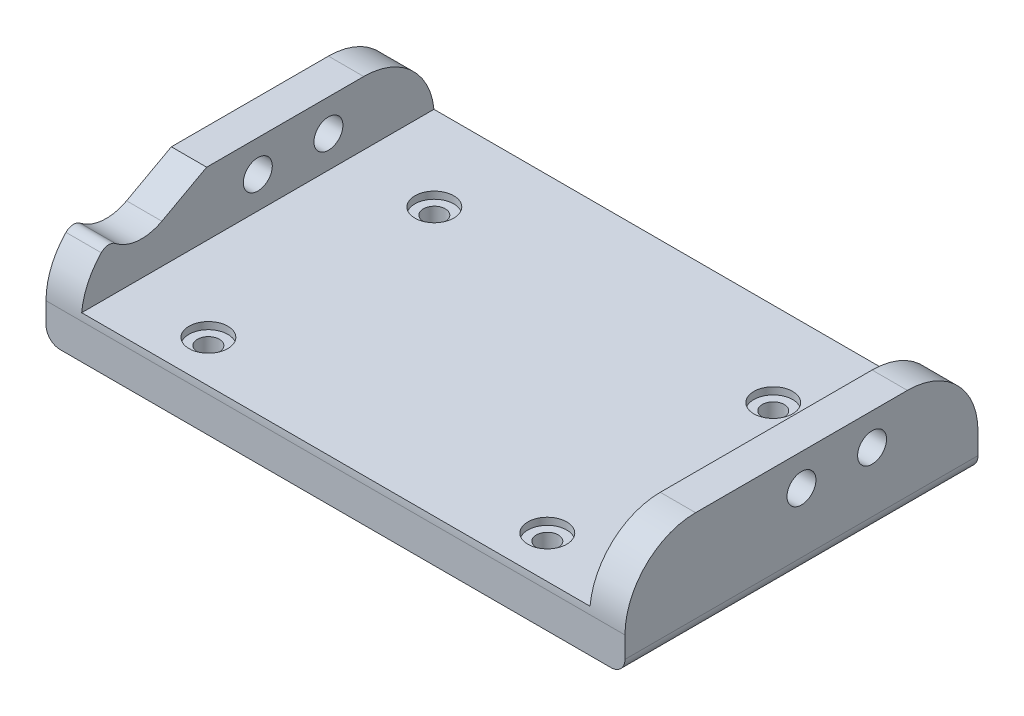
ISO-10303-21;
HEADER;
FILE_DESCRIPTION(('STEP AP214'),'2;1');
FILE_NAME('part.step','',(''),(''),'','','');
FILE_SCHEMA(('AUTOMOTIVE_DESIGN { 1 0 10303 214 1 1 1 1 }'));
ENDSEC;
DATA;
#1=APPLICATION_CONTEXT('core data for automotive mechanical design processes');
#2=APPLICATION_PROTOCOL_DEFINITION('international standard','automotive_design',2000,#1);
#3=PRODUCT_CONTEXT('',#1,'mechanical');
#4=PRODUCT('Part','Part','',(#3));
#5=PRODUCT_RELATED_PRODUCT_CATEGORY('part','',(#4));
#6=PRODUCT_DEFINITION_FORMATION('','',#4);
#7=PRODUCT_DEFINITION_CONTEXT('part definition',#1,'design');
#8=PRODUCT_DEFINITION('design','',#6,#7);
#9=PRODUCT_DEFINITION_SHAPE('','',#8);
#10=(LENGTH_UNIT() NAMED_UNIT(*) SI_UNIT(.MILLI.,.METRE.));
#11=(NAMED_UNIT(*) PLANE_ANGLE_UNIT() SI_UNIT($,.RADIAN.));
#12=(NAMED_UNIT(*) SI_UNIT($,.STERADIAN.) SOLID_ANGLE_UNIT());
#13=UNCERTAINTY_MEASURE_WITH_UNIT(LENGTH_MEASURE(1.E-05),#10,'distance_accuracy_value','');
#14=(GEOMETRIC_REPRESENTATION_CONTEXT(3) GLOBAL_UNCERTAINTY_ASSIGNED_CONTEXT((#13)) GLOBAL_UNIT_ASSIGNED_CONTEXT((#10,
#11,#12)) REPRESENTATION_CONTEXT('',''));
#15=CARTESIAN_POINT('',(0.,0.,0.));
#16=DIRECTION('',(0.,0.,1.));
#17=DIRECTION('',(1.,0.,0.));
#18=AXIS2_PLACEMENT_3D('',#15,#16,#17);
#19=CARTESIAN_POINT('',(-36.,6.,-20.));
#20=DIRECTION('',(0.,0.,1.));
#21=DIRECTION('',(1.,0.,0.));
#22=AXIS2_PLACEMENT_3D('',#19,#20,#21);
#23=PLANE('',#22);
#24=DIRECTION('',(0.,-1.,0.));
#25=VECTOR('',#24,1.);
#26=CARTESIAN_POINT('',(-34.,6.,-20.));
#27=LINE('',#26,#25);
#28=CARTESIAN_POINT('',(-34.,5.,-20.));
#29=VERTEX_POINT('',#28);
#30=CARTESIAN_POINT('',(-34.,0.,-20.));
#31=VERTEX_POINT('',#30);
#32=EDGE_CURVE('E290',#29,#31,#27,.T.);
#33=ORIENTED_EDGE('',*,*,#32,.F.);
#34=DIRECTION('',(-1.,0.,0.));
#35=VECTOR('',#34,1.);
#36=CARTESIAN_POINT('',(-36.,5.,-20.));
#37=LINE('',#36,#35);
#38=CARTESIAN_POINT('',(41.,5.,-20.));
#39=VERTEX_POINT('',#38);
#40=EDGE_CURVE('E216',#29,#39,#37,.F.);
#41=ORIENTED_EDGE('',*,*,#40,.T.);
#42=DIRECTION('',(0.,1.,0.));
#43=VECTOR('',#42,1.);
#44=CARTESIAN_POINT('',(41.,0.,-20.));
#45=LINE('',#44,#43);
#46=CARTESIAN_POINT('',(41.,2.,-20.));
#47=VERTEX_POINT('',#46);
#48=EDGE_CURVE('E202',#47,#39,#45,.T.);
#49=ORIENTED_EDGE('',*,*,#48,.F.);
#50=CARTESIAN_POINT('',(39.,2.,-20.));
#51=DIRECTION('',(0.,0.,1.));
#52=DIRECTION('',(1.,0.,0.));
#53=AXIS2_PLACEMENT_3D('',#50,#51,#52);
#54=CIRCLE('',#53,2.);
#55=CARTESIAN_POINT('',(39.,0.,-20.));
#56=VERTEX_POINT('',#55);
#57=EDGE_CURVE('E240',#47,#56,#54,.F.);
#58=ORIENTED_EDGE('',*,*,#57,.T.);
#59=DIRECTION('',(-1.,0.,0.));
#60=VECTOR('',#59,1.);
#61=CARTESIAN_POINT('',(-36.,0.,-20.));
#62=LINE('',#61,#60);
#63=EDGE_CURVE('E208',#56,#31,#62,.T.);
#64=ORIENTED_EDGE('',*,*,#63,.T.);
#65=EDGE_LOOP('',(#33,#41,#49,#58,#64));
#66=FACE_BOUND('',#65,.T.);
#67=ADVANCED_FACE('F39',(#66),#23,.F.);
#68=CARTESIAN_POINT('',(0.,0.,0.));
#69=DIRECTION('',(0.,1.,0.));
#70=DIRECTION('',(0.,0.,1.));
#71=AXIS2_PLACEMENT_3D('',#68,#69,#70);
#72=PLANE('',#71);
#73=CARTESIAN_POINT('',(24.,0.,24.));
#74=DIRECTION('',(0.,-1.,0.));
#75=DIRECTION('',(0.,0.,-1.));
#76=AXIS2_PLACEMENT_3D('',#73,#74,#75);
#77=CIRCLE('',#76,1.55);
#78=CARTESIAN_POINT('',(24.,0.,22.45));
#79=VERTEX_POINT('',#78);
#80=EDGE_CURVE('E327',#79,#79,#77,.T.);
#81=ORIENTED_EDGE('',*,*,#80,.F.);
#82=EDGE_LOOP('',(#81));
#83=FACE_BOUND('',#82,.T.);
#84=CARTESIAN_POINT('',(-24.,0.,-8.));
#85=DIRECTION('',(0.,-1.,0.));
#86=DIRECTION('',(0.,0.,-1.));
#87=AXIS2_PLACEMENT_3D('',#84,#85,#86);
#88=CIRCLE('',#87,1.55);
#89=CARTESIAN_POINT('',(-24.,0.,-9.55));
#90=VERTEX_POINT('',#89);
#91=EDGE_CURVE('E261',#90,#90,#88,.T.);
#92=ORIENTED_EDGE('',*,*,#91,.F.);
#93=EDGE_LOOP('',(#92));
#94=FACE_BOUND('',#93,.T.);
#95=CARTESIAN_POINT('',(-24.,0.,24.));
#96=DIRECTION('',(0.,-1.,0.));
#97=DIRECTION('',(0.,0.,-1.));
#98=AXIS2_PLACEMENT_3D('',#95,#96,#97);
#99=CIRCLE('',#98,1.55);
#100=CARTESIAN_POINT('',(-24.,0.,22.45));
#101=VERTEX_POINT('',#100);
#102=EDGE_CURVE('E323',#101,#101,#99,.T.);
#103=ORIENTED_EDGE('',*,*,#102,.F.);
#104=EDGE_LOOP('',(#103));
#105=FACE_BOUND('',#104,.T.);
#106=CARTESIAN_POINT('',(24.,0.,-8.));
#107=DIRECTION('',(0.,-1.,0.));
#108=DIRECTION('',(0.,0.,-1.));
#109=AXIS2_PLACEMENT_3D('',#106,#107,#108);
#110=CIRCLE('',#109,1.55);
#111=CARTESIAN_POINT('',(24.,0.,-9.55));
#112=VERTEX_POINT('',#111);
#113=EDGE_CURVE('E324',#112,#112,#110,.T.);
#114=ORIENTED_EDGE('',*,*,#113,.F.);
#115=EDGE_LOOP('',(#114));
#116=FACE_BOUND('',#115,.T.);
#117=DIRECTION('',(-1.,0.,0.));
#118=VECTOR('',#117,1.);
#119=CARTESIAN_POINT('',(-34.,0.,-19.4493213474616));
#120=LINE('',#119,#118);
#121=CARTESIAN_POINT('',(-34.,0.,-19.4493213474616));
#122=VERTEX_POINT('',#121);
#123=CARTESIAN_POINT('',(-39.,0.,-19.4493213474616));
#124=VERTEX_POINT('',#123);
#125=EDGE_CURVE('E176',#122,#124,#120,.T.);
#126=ORIENTED_EDGE('',*,*,#125,.F.);
#127=DIRECTION('',(0.,0.,-1.));
#128=VECTOR('',#127,1.);
#129=CARTESIAN_POINT('',(-34.,0.,0.));
#130=LINE('',#129,#128);
#131=EDGE_CURVE('E454',#122,#31,#130,.T.);
#132=ORIENTED_EDGE('',*,*,#131,.T.);
#133=ORIENTED_EDGE('',*,*,#63,.F.);
#134=DIRECTION('',(0.,0.,-1.));
#135=VECTOR('',#134,1.);
#136=CARTESIAN_POINT('',(39.,0.,0.));
#137=LINE('',#136,#135);
#138=CARTESIAN_POINT('',(39.,0.,30.));
#139=VERTEX_POINT('',#138);
#140=EDGE_CURVE('E235',#56,#139,#137,.F.);
#141=ORIENTED_EDGE('',*,*,#140,.T.);
#142=DIRECTION('',(1.,0.,0.));
#143=VECTOR('',#142,1.);
#144=CARTESIAN_POINT('',(-39.,0.,30.));
#145=LINE('',#144,#143);
#146=CARTESIAN_POINT('',(-39.,0.,30.));
#147=VERTEX_POINT('',#146);
#148=EDGE_CURVE('E338',#147,#139,#145,.T.);
#149=ORIENTED_EDGE('',*,*,#148,.F.);
#150=DIRECTION('',(0.,0.,-1.));
#151=VECTOR('',#150,1.);
#152=CARTESIAN_POINT('',(-39.,0.,0.));
#153=LINE('',#152,#151);
#154=EDGE_CURVE('E237',#147,#124,#153,.T.);
#155=ORIENTED_EDGE('',*,*,#154,.T.);
#156=EDGE_LOOP('',(#126,#132,#133,#141,#149,#155));
#157=FACE_BOUND('',#156,.T.);
#158=ADVANCED_FACE('F383',(#83,#94,#105,#116,#157),#72,.F.);
#159=CARTESIAN_POINT('',(-41.,0.,0.));
#160=DIRECTION('',(1.,0.,0.));
#161=DIRECTION('',(0.,0.,1.));
#162=AXIS2_PLACEMENT_3D('',#159,#160,#161);
#163=PLANE('',#162);
#164=CARTESIAN_POINT('',(-41.,10.5,5.00000000000002));
#165=DIRECTION('',(1.,0.,0.));
#166=DIRECTION('',(0.,0.,-1.));
#167=AXIS2_PLACEMENT_3D('',#164,#165,#166);
#168=CIRCLE('',#167,2.05);
#169=CARTESIAN_POINT('',(-41.,10.5,2.95000000000002));
#170=VERTEX_POINT('',#169);
#171=EDGE_CURVE('E187',#170,#170,#168,.T.);
#172=ORIENTED_EDGE('',*,*,#171,.T.);
#173=EDGE_LOOP('',(#172));
#174=FACE_BOUND('',#173,.T.);
#175=CARTESIAN_POINT('',(-41.,10.5,-4.99999999999998));
#176=DIRECTION('',(1.,0.,0.));
#177=DIRECTION('',(0.,0.,-1.));
#178=AXIS2_PLACEMENT_3D('',#175,#176,#177);
#179=CIRCLE('',#178,2.05);
#180=CARTESIAN_POINT('',(-41.,10.5,-7.04999999999998));
#181=VERTEX_POINT('',#180);
#182=EDGE_CURVE('E348',#181,#181,#179,.T.);
#183=ORIENTED_EDGE('',*,*,#182,.T.);
#184=EDGE_LOOP('',(#183));
#185=FACE_BOUND('',#184,.T.);
#186=CARTESIAN_POINT('',(-41.,5.,20.));
#187=DIRECTION('',(1.,0.,0.));
#188=DIRECTION('',(0.,0.,-1.));
#189=AXIS2_PLACEMENT_3D('',#186,#187,#188);
#190=CIRCLE('',#189,10.);
#191=CARTESIAN_POINT('',(-41.,5.,30.));
#192=VERTEX_POINT('',#191);
#193=CARTESIAN_POINT('',(-41.,11.9677436639421,27.1729037518703));
#194=VERTEX_POINT('',#193);
#195=EDGE_CURVE('E272',#192,#194,#190,.F.);
#196=ORIENTED_EDGE('',*,*,#195,.T.);
#197=CARTESIAN_POINT('',(-41.,10.9225821143508,26.0969681890897));
#198=DIRECTION('',(1.,0.,0.));
#199=DIRECTION('',(0.,0.,-1.));
#200=AXIS2_PLACEMENT_3D('',#197,#198,#199);
#201=CIRCLE('',#200,1.5);
#202=CARTESIAN_POINT('',(-41.,12.1012442292407,25.1691990265697));
#203=VERTEX_POINT('',#202);
#204=EDGE_CURVE('E11',#194,#203,#201,.F.);
#205=ORIENTED_EDGE('',*,*,#204,.T.);
#206=CARTESIAN_POINT('',(-41.,16.8158926888006,21.4581223764896));
#207=DIRECTION('',(-1.,0.,0.));
#208=DIRECTION('',(0.,0.,1.));
#209=AXIS2_PLACEMENT_3D('',#206,#207,#208);
#210=CIRCLE('',#209,5.99999999999999);
#211=CARTESIAN_POINT('',(-41.,11.5462592479333,18.5891568139752));
#212=VERTEX_POINT('',#211);
#213=EDGE_CURVE('E167',#212,#203,#210,.T.);
#214=ORIENTED_EDGE('',*,*,#213,.F.);
#215=DIRECTION('',(0.,-0.478160927085719,0.87827224014455));
#216=VECTOR('',#215,1.);
#217=CARTESIAN_POINT('',(-41.,16.7129651620565,9.09909997260642));
#218=LINE('',#217,#216);
#219=CARTESIAN_POINT('',(-41.,15.,12.2454251216273));
#220=VERTEX_POINT('',#219);
#221=EDGE_CURVE('E158',#220,#212,#218,.T.);
#222=ORIENTED_EDGE('',*,*,#221,.F.);
#223=DIRECTION('',(0.,0.,1.));
#224=VECTOR('',#223,1.);
#225=CARTESIAN_POINT('',(-41.,15.,20.));
#226=LINE('',#225,#224);
#227=CARTESIAN_POINT('',(-41.,15.,-10.));
#228=VERTEX_POINT('',#227);
#229=EDGE_CURVE('E173',#228,#220,#226,.T.);
#230=ORIENTED_EDGE('',*,*,#229,.F.);
#231=CARTESIAN_POINT('',(-41.,5.,-10.));
#232=DIRECTION('',(1.,0.,0.));
#233=DIRECTION('',(0.,0.,-1.));
#234=AXIS2_PLACEMENT_3D('',#231,#232,#233);
#235=CIRCLE('',#234,10.);
#236=CARTESIAN_POINT('',(-41.,5.,-20.));
#237=VERTEX_POINT('',#236);
#238=EDGE_CURVE('E226',#228,#237,#235,.F.);
#239=ORIENTED_EDGE('',*,*,#238,.T.);
#240=DIRECTION('',(0.,-0.993989683802136,0.109473779942637));
#241=VECTOR('',#240,1.);
#242=CARTESIAN_POINT('',(-41.,-2.11639361572149,-19.2162307905524));
#243=LINE('',#242,#241);
#244=CARTESIAN_POINT('',(-41.,2.,-19.669592808477));
#245=VERTEX_POINT('',#244);
#246=EDGE_CURVE('E446',#237,#245,#243,.T.);
#247=ORIENTED_EDGE('',*,*,#246,.T.);
#248=DIRECTION('',(0.,0.,-1.));
#249=VECTOR('',#248,1.);
#250=CARTESIAN_POINT('',(-41.,2.,0.));
#251=LINE('',#250,#249);
#252=CARTESIAN_POINT('',(-41.,2.,30.));
#253=VERTEX_POINT('',#252);
#254=EDGE_CURVE('E242',#245,#253,#251,.F.);
#255=ORIENTED_EDGE('',*,*,#254,.T.);
#256=DIRECTION('',(0.,-1.,0.));
#257=VECTOR('',#256,1.);
#258=CARTESIAN_POINT('',(-41.,15.,30.));
#259=LINE('',#258,#257);
#260=EDGE_CURVE('E332',#192,#253,#259,.T.);
#261=ORIENTED_EDGE('',*,*,#260,.F.);
#262=EDGE_LOOP('',(#196,#205,#214,#222,#230,#239,#247,#255,#261));
#263=FACE_BOUND('',#262,.T.);
#264=ADVANCED_FACE('F171',(#174,#185,#263),#163,.F.);
#265=CARTESIAN_POINT('',(-39.,2.,0.));
#266=DIRECTION('',(0.,0.,-1.));
#267=DIRECTION('',(-1.,0.,0.));
#268=AXIS2_PLACEMENT_3D('',#265,#266,#267);
#269=CYLINDRICAL_SURFACE('',#268,2.);
#270=ORIENTED_EDGE('',*,*,#254,.F.);
#271=CARTESIAN_POINT('',(-39.,2.,-19.669592808477));
#272=DIRECTION('',(0.,-0.109473779942637,-0.993989683802136));
#273=DIRECTION('',(0.,0.993989683802136,-0.109473779942637));
#274=AXIS2_PLACEMENT_3D('',#271,#272,#273);
#275=ELLIPSE('',#274,2.01209331705511,2.);
#276=EDGE_CURVE('E276',#245,#124,#275,.F.);
#277=ORIENTED_EDGE('',*,*,#276,.T.);
#278=ORIENTED_EDGE('',*,*,#154,.F.);
#279=CARTESIAN_POINT('',(-39.,2.,30.));
#280=DIRECTION('',(0.,0.,1.));
#281=DIRECTION('',(1.,0.,0.));
#282=AXIS2_PLACEMENT_3D('',#279,#280,#281);
#283=CIRCLE('',#282,2.);
#284=EDGE_CURVE('E335',#253,#147,#283,.T.);
#285=ORIENTED_EDGE('',*,*,#284,.F.);
#286=EDGE_LOOP('',(#270,#277,#278,#285));
#287=FACE_BOUND('',#286,.T.);
#288=ADVANCED_FACE('F395',(#287),#269,.T.);
#289=CARTESIAN_POINT('',(24.,10.,24.));
#290=DIRECTION('',(0.,-1.,0.));
#291=DIRECTION('',(0.,0.,-1.));
#292=AXIS2_PLACEMENT_3D('',#289,#290,#291);
#293=CYLINDRICAL_SURFACE('',#292,1.55);
#294=ORIENTED_EDGE('',*,*,#80,.T.);
#295=EDGE_LOOP('',(#294));
#296=FACE_BOUND('',#295,.T.);
#297=CARTESIAN_POINT('',(24.,5.,24.));
#298=DIRECTION('',(0.,1.,0.));
#299=DIRECTION('',(0.,0.,1.));
#300=AXIS2_PLACEMENT_3D('',#297,#298,#299);
#301=CIRCLE('',#300,1.55);
#302=CARTESIAN_POINT('',(24.,5.,25.55));
#303=VERTEX_POINT('',#302);
#304=EDGE_CURVE('E258',#303,#303,#301,.F.);
#305=ORIENTED_EDGE('',*,*,#304,.F.);
#306=EDGE_LOOP('',(#305));
#307=FACE_BOUND('',#306,.T.);
#308=ADVANCED_FACE('F398',(#296,#307),#293,.F.);
#309=CARTESIAN_POINT('',(-24.,10.,-8.));
#310=DIRECTION('',(0.,-1.,0.));
#311=DIRECTION('',(0.,0.,-1.));
#312=AXIS2_PLACEMENT_3D('',#309,#310,#311);
#313=CYLINDRICAL_SURFACE('',#312,1.55);
#314=ORIENTED_EDGE('',*,*,#91,.T.);
#315=EDGE_LOOP('',(#314));
#316=FACE_BOUND('',#315,.T.);
#317=CARTESIAN_POINT('',(-24.,5.,-8.));
#318=DIRECTION('',(0.,1.,0.));
#319=DIRECTION('',(0.,0.,1.));
#320=AXIS2_PLACEMENT_3D('',#317,#318,#319);
#321=CIRCLE('',#320,1.55);
#322=CARTESIAN_POINT('',(-24.,5.,-6.45));
#323=VERTEX_POINT('',#322);
#324=EDGE_CURVE('E255',#323,#323,#321,.F.);
#325=ORIENTED_EDGE('',*,*,#324,.F.);
#326=EDGE_LOOP('',(#325));
#327=FACE_BOUND('',#326,.T.);
#328=ADVANCED_FACE('F499',(#316,#327),#313,.F.);
#329=CARTESIAN_POINT('',(-24.,10.,24.));
#330=DIRECTION('',(0.,-1.,0.));
#331=DIRECTION('',(0.,0.,-1.));
#332=AXIS2_PLACEMENT_3D('',#329,#330,#331);
#333=CYLINDRICAL_SURFACE('',#332,1.55);
#334=ORIENTED_EDGE('',*,*,#102,.T.);
#335=EDGE_LOOP('',(#334));
#336=FACE_BOUND('',#335,.T.);
#337=CARTESIAN_POINT('',(-24.,5.,24.));
#338=DIRECTION('',(0.,1.,0.));
#339=DIRECTION('',(0.,0.,1.));
#340=AXIS2_PLACEMENT_3D('',#337,#338,#339);
#341=CIRCLE('',#340,1.55);
#342=CARTESIAN_POINT('',(-24.,5.,25.55));
#343=VERTEX_POINT('',#342);
#344=EDGE_CURVE('E251',#343,#343,#341,.F.);
#345=ORIENTED_EDGE('',*,*,#344,.F.);
#346=EDGE_LOOP('',(#345));
#347=FACE_BOUND('',#346,.T.);
#348=ADVANCED_FACE('F502',(#336,#347),#333,.F.);
#349=CARTESIAN_POINT('',(24.,10.,-8.));
#350=DIRECTION('',(0.,-1.,0.));
#351=DIRECTION('',(0.,0.,-1.));
#352=AXIS2_PLACEMENT_3D('',#349,#350,#351);
#353=CYLINDRICAL_SURFACE('',#352,1.55);
#354=ORIENTED_EDGE('',*,*,#113,.T.);
#355=EDGE_LOOP('',(#354));
#356=FACE_BOUND('',#355,.T.);
#357=CARTESIAN_POINT('',(24.,5.,-8.));
#358=DIRECTION('',(0.,1.,0.));
#359=DIRECTION('',(0.,0.,1.));
#360=AXIS2_PLACEMENT_3D('',#357,#358,#359);
#361=CIRCLE('',#360,1.55);
#362=CARTESIAN_POINT('',(24.,5.,-6.45));
#363=VERTEX_POINT('',#362);
#364=EDGE_CURVE('E248',#363,#363,#361,.F.);
#365=ORIENTED_EDGE('',*,*,#364,.F.);
#366=EDGE_LOOP('',(#365));
#367=FACE_BOUND('',#366,.T.);
#368=ADVANCED_FACE('F504',(#356,#367),#353,.F.);
#369=CARTESIAN_POINT('',(0.,6.,0.));
#370=DIRECTION('',(0.,1.,0.));
#371=DIRECTION('',(0.,0.,1.));
#372=AXIS2_PLACEMENT_3D('',#369,#370,#371);
#373=PLANE('',#372);
#374=CARTESIAN_POINT('',(24.,6.,-8.));
#375=DIRECTION('',(0.,1.,0.));
#376=DIRECTION('',(0.,0.,1.));
#377=AXIS2_PLACEMENT_3D('',#374,#375,#376);
#378=CIRCLE('',#377,2.75);
#379=CARTESIAN_POINT('',(24.,6.,-5.25));
#380=VERTEX_POINT('',#379);
#381=EDGE_CURVE('E312',#380,#380,#378,.T.);
#382=ORIENTED_EDGE('',*,*,#381,.F.);
#383=EDGE_LOOP('',(#382));
#384=FACE_BOUND('',#383,.T.);
#385=CARTESIAN_POINT('',(24.,6.,24.));
#386=DIRECTION('',(0.,1.,0.));
#387=DIRECTION('',(0.,0.,1.));
#388=AXIS2_PLACEMENT_3D('',#385,#386,#387);
#389=CIRCLE('',#388,2.75);
#390=CARTESIAN_POINT('',(24.,6.,26.75));
#391=VERTEX_POINT('',#390);
#392=EDGE_CURVE('E306',#391,#391,#389,.T.);
#393=ORIENTED_EDGE('',*,*,#392,.F.);
#394=EDGE_LOOP('',(#393));
#395=FACE_BOUND('',#394,.T.);
#396=CARTESIAN_POINT('',(-24.,6.,24.));
#397=DIRECTION('',(0.,1.,0.));
#398=DIRECTION('',(0.,0.,1.));
#399=AXIS2_PLACEMENT_3D('',#396,#397,#398);
#400=CIRCLE('',#399,2.75);
#401=CARTESIAN_POINT('',(-24.,6.,26.75));
#402=VERTEX_POINT('',#401);
#403=EDGE_CURVE('E299',#402,#402,#400,.T.);
#404=ORIENTED_EDGE('',*,*,#403,.F.);
#405=EDGE_LOOP('',(#404));
#406=FACE_BOUND('',#405,.T.);
#407=CARTESIAN_POINT('',(-24.,6.,-8.));
#408=DIRECTION('',(0.,1.,0.));
#409=DIRECTION('',(0.,0.,1.));
#410=AXIS2_PLACEMENT_3D('',#407,#408,#409);
#411=CIRCLE('',#410,2.75);
#412=CARTESIAN_POINT('',(-24.,6.,-5.25));
#413=VERTEX_POINT('',#412);
#414=EDGE_CURVE('E302',#413,#413,#411,.T.);
#415=ORIENTED_EDGE('',*,*,#414,.F.);
#416=EDGE_LOOP('',(#415));
#417=FACE_BOUND('',#416,.T.);
#418=DIRECTION('',(-1.,0.,0.));
#419=VECTOR('',#418,1.);
#420=CARTESIAN_POINT('',(-36.,6.,29.9498743710662));
#421=LINE('',#420,#419);
#422=CARTESIAN_POINT('',(-36.,6.,29.9498743710662));
#423=VERTEX_POINT('',#422);
#424=CARTESIAN_POINT('',(36.,6.,29.9498743710662));
#425=VERTEX_POINT('',#424);
#426=EDGE_CURVE('E263',#423,#425,#421,.F.);
#427=ORIENTED_EDGE('',*,*,#426,.T.);
#428=DIRECTION('',(0.,0.,-1.));
#429=VECTOR('',#428,1.);
#430=CARTESIAN_POINT('',(36.,6.,-20.));
#431=LINE('',#430,#429);
#432=CARTESIAN_POINT('',(36.,6.,-19.9498743710662));
#433=VERTEX_POINT('',#432);
#434=EDGE_CURVE('E211',#425,#433,#431,.T.);
#435=ORIENTED_EDGE('',*,*,#434,.T.);
#436=DIRECTION('',(-1.,0.,0.));
#437=VECTOR('',#436,1.);
#438=CARTESIAN_POINT('',(36.,6.,-19.9498743710662));
#439=LINE('',#438,#437);
#440=CARTESIAN_POINT('',(-36.,6.,-19.9498743710662));
#441=VERTEX_POINT('',#440);
#442=EDGE_CURVE('E221',#433,#441,#439,.T.);
#443=ORIENTED_EDGE('',*,*,#442,.T.);
#444=DIRECTION('',(0.,0.,1.));
#445=VECTOR('',#444,1.);
#446=CARTESIAN_POINT('',(-36.,6.,-20.));
#447=LINE('',#446,#445);
#448=EDGE_CURVE('E213',#441,#423,#447,.T.);
#449=ORIENTED_EDGE('',*,*,#448,.T.);
#450=EDGE_LOOP('',(#427,#435,#443,#449));
#451=FACE_BOUND('',#450,.T.);
#452=ADVANCED_FACE('F443',(#384,#395,#406,#417,#451),#373,.T.);
#453=CARTESIAN_POINT('',(36.,0.,0.));
#454=DIRECTION('',(-1.,0.,0.));
#455=DIRECTION('',(0.,0.,1.));
#456=AXIS2_PLACEMENT_3D('',#453,#454,#455);
#457=PLANE('',#456);
#458=CARTESIAN_POINT('',(36.,10.5,-5.));
#459=DIRECTION('',(1.,0.,0.));
#460=DIRECTION('',(0.,0.,-1.));
#461=AXIS2_PLACEMENT_3D('',#458,#459,#460);
#462=CIRCLE('',#461,2.05);
#463=CARTESIAN_POINT('',(36.,10.5,-7.05));
#464=VERTEX_POINT('',#463);
#465=EDGE_CURVE('E181',#464,#464,#462,.T.);
#466=ORIENTED_EDGE('',*,*,#465,.T.);
#467=EDGE_LOOP('',(#466));
#468=FACE_BOUND('',#467,.T.);
#469=CARTESIAN_POINT('',(36.,10.5,5.));
#470=DIRECTION('',(1.,0.,0.));
#471=DIRECTION('',(0.,0.,-1.));
#472=AXIS2_PLACEMENT_3D('',#469,#470,#471);
#473=CIRCLE('',#472,2.05);
#474=CARTESIAN_POINT('',(36.,10.5,2.95));
#475=VERTEX_POINT('',#474);
#476=EDGE_CURVE('E194',#475,#475,#473,.T.);
#477=ORIENTED_EDGE('',*,*,#476,.T.);
#478=EDGE_LOOP('',(#477));
#479=FACE_BOUND('',#478,.T.);
#480=ORIENTED_EDGE('',*,*,#434,.F.);
#481=CARTESIAN_POINT('',(36.,5.,20.));
#482=DIRECTION('',(-1.,0.,0.));
#483=DIRECTION('',(0.,0.,1.));
#484=AXIS2_PLACEMENT_3D('',#481,#482,#483);
#485=CIRCLE('',#484,10.);
#486=CARTESIAN_POINT('',(36.,15.,20.));
#487=VERTEX_POINT('',#486);
#488=EDGE_CURVE('E265',#425,#487,#485,.T.);
#489=ORIENTED_EDGE('',*,*,#488,.T.);
#490=DIRECTION('',(0.,0.,1.));
#491=VECTOR('',#490,1.);
#492=CARTESIAN_POINT('',(36.,15.,20.));
#493=LINE('',#492,#491);
#494=CARTESIAN_POINT('',(36.,15.,-10.));
#495=VERTEX_POINT('',#494);
#496=EDGE_CURVE('E199',#495,#487,#493,.T.);
#497=ORIENTED_EDGE('',*,*,#496,.F.);
#498=CARTESIAN_POINT('',(36.,5.,-10.));
#499=DIRECTION('',(-1.,0.,0.));
#500=DIRECTION('',(0.,0.,1.));
#501=AXIS2_PLACEMENT_3D('',#498,#499,#500);
#502=CIRCLE('',#501,10.);
#503=EDGE_CURVE('E230',#495,#433,#502,.T.);
#504=ORIENTED_EDGE('',*,*,#503,.T.);
#505=EDGE_LOOP('',(#480,#489,#497,#504));
#506=FACE_BOUND('',#505,.T.);
#507=ADVANCED_FACE('F440',(#468,#479,#506),#457,.T.);
#508=CARTESIAN_POINT('',(41.,0.,0.));
#509=DIRECTION('',(-1.,0.,0.));
#510=DIRECTION('',(0.,0.,1.));
#511=AXIS2_PLACEMENT_3D('',#508,#509,#510);
#512=PLANE('',#511);
#513=DIRECTION('',(0.,0.,1.));
#514=VECTOR('',#513,1.);
#515=CARTESIAN_POINT('',(41.,15.,20.));
#516=LINE('',#515,#514);
#517=CARTESIAN_POINT('',(41.,15.,-10.));
#518=VERTEX_POINT('',#517);
#519=CARTESIAN_POINT('',(41.,15.,20.));
#520=VERTEX_POINT('',#519);
#521=EDGE_CURVE('E205',#518,#520,#516,.T.);
#522=ORIENTED_EDGE('',*,*,#521,.T.);
#523=CARTESIAN_POINT('',(41.,5.,20.));
#524=DIRECTION('',(-1.,0.,0.));
#525=DIRECTION('',(0.,0.,1.));
#526=AXIS2_PLACEMENT_3D('',#523,#524,#525);
#527=CIRCLE('',#526,10.);
#528=CARTESIAN_POINT('',(41.,5.,30.));
#529=VERTEX_POINT('',#528);
#530=EDGE_CURVE('E269',#520,#529,#527,.F.);
#531=ORIENTED_EDGE('',*,*,#530,.T.);
#532=DIRECTION('',(0.,1.,0.));
#533=VECTOR('',#532,1.);
#534=CARTESIAN_POINT('',(41.,2.,30.));
#535=LINE('',#534,#533);
#536=CARTESIAN_POINT('',(41.,2.,30.));
#537=VERTEX_POINT('',#536);
#538=EDGE_CURVE('E344',#537,#529,#535,.T.);
#539=ORIENTED_EDGE('',*,*,#538,.F.);
#540=DIRECTION('',(0.,0.,-1.));
#541=VECTOR('',#540,1.);
#542=CARTESIAN_POINT('',(41.,2.,0.));
#543=LINE('',#542,#541);
#544=EDGE_CURVE('E244',#537,#47,#543,.T.);
#545=ORIENTED_EDGE('',*,*,#544,.T.);
#546=ORIENTED_EDGE('',*,*,#48,.T.);
#547=CARTESIAN_POINT('',(41.,5.,-10.));
#548=DIRECTION('',(-1.,0.,0.));
#549=DIRECTION('',(0.,0.,1.));
#550=AXIS2_PLACEMENT_3D('',#547,#548,#549);
#551=CIRCLE('',#550,10.);
#552=EDGE_CURVE('E233',#39,#518,#551,.F.);
#553=ORIENTED_EDGE('',*,*,#552,.T.);
#554=EDGE_LOOP('',(#522,#531,#539,#545,#546,#553));
#555=FACE_BOUND('',#554,.T.);
#556=CARTESIAN_POINT('',(41.,10.5,5.));
#557=DIRECTION('',(1.,0.,0.));
#558=DIRECTION('',(0.,0.,-1.));
#559=AXIS2_PLACEMENT_3D('',#556,#557,#558);
#560=CIRCLE('',#559,2.05);
#561=CARTESIAN_POINT('',(41.,10.5,2.95));
#562=VERTEX_POINT('',#561);
#563=EDGE_CURVE('E196',#562,#562,#560,.T.);
#564=ORIENTED_EDGE('',*,*,#563,.F.);
#565=EDGE_LOOP('',(#564));
#566=FACE_BOUND('',#565,.T.);
#567=CARTESIAN_POINT('',(41.,10.5,-5.));
#568=DIRECTION('',(1.,0.,0.));
#569=DIRECTION('',(0.,0.,-1.));
#570=AXIS2_PLACEMENT_3D('',#567,#568,#569);
#571=CIRCLE('',#570,2.05);
#572=CARTESIAN_POINT('',(41.,10.5,-7.05000000000001));
#573=VERTEX_POINT('',#572);
#574=EDGE_CURVE('E185',#573,#573,#571,.T.);
#575=ORIENTED_EDGE('',*,*,#574,.F.);
#576=EDGE_LOOP('',(#575));
#577=FACE_BOUND('',#576,.T.);
#578=ADVANCED_FACE('F422',(#555,#566,#577),#512,.F.);
#579=CARTESIAN_POINT('',(41.,15.,20.));
#580=DIRECTION('',(0.,-1.,0.));
#581=DIRECTION('',(0.,0.,-1.));
#582=AXIS2_PLACEMENT_3D('',#579,#580,#581);
#583=PLANE('',#582);
#584=ORIENTED_EDGE('',*,*,#496,.T.);
#585=DIRECTION('',(-1.,0.,0.));
#586=VECTOR('',#585,1.);
#587=CARTESIAN_POINT('',(41.,15.,20.));
#588=LINE('',#587,#586);
#589=EDGE_CURVE('E267',#487,#520,#588,.F.);
#590=ORIENTED_EDGE('',*,*,#589,.T.);
#591=ORIENTED_EDGE('',*,*,#521,.F.);
#592=DIRECTION('',(-1.,0.,0.));
#593=VECTOR('',#592,1.);
#594=CARTESIAN_POINT('',(41.,15.,-10.));
#595=LINE('',#594,#593);
#596=EDGE_CURVE('E228',#518,#495,#595,.T.);
#597=ORIENTED_EDGE('',*,*,#596,.T.);
#598=EDGE_LOOP('',(#584,#590,#591,#597));
#599=FACE_BOUND('',#598,.T.);
#600=ADVANCED_FACE('F436',(#599),#583,.F.);
#601=CARTESIAN_POINT('',(41.,10.5,5.));
#602=DIRECTION('',(-1.,0.,0.));
#603=DIRECTION('',(0.,0.,1.));
#604=AXIS2_PLACEMENT_3D('',#601,#602,#603);
#605=CYLINDRICAL_SURFACE('',#604,2.05);
#606=ORIENTED_EDGE('',*,*,#563,.T.);
#607=EDGE_LOOP('',(#606));
#608=FACE_BOUND('',#607,.T.);
#609=ORIENTED_EDGE('',*,*,#476,.F.);
#610=EDGE_LOOP('',(#609));
#611=FACE_BOUND('',#610,.T.);
#612=ADVANCED_FACE('F524',(#608,#611),#605,.F.);
#613=CARTESIAN_POINT('',(41.,10.5,-5.));
#614=DIRECTION('',(-1.,0.,0.));
#615=DIRECTION('',(0.,0.,1.));
#616=AXIS2_PLACEMENT_3D('',#613,#614,#615);
#617=CYLINDRICAL_SURFACE('',#616,2.05);
#618=ORIENTED_EDGE('',*,*,#574,.T.);
#619=EDGE_LOOP('',(#618));
#620=FACE_BOUND('',#619,.T.);
#621=ORIENTED_EDGE('',*,*,#465,.F.);
#622=EDGE_LOOP('',(#621));
#623=FACE_BOUND('',#622,.T.);
#624=ADVANCED_FACE('F361',(#620,#623),#617,.F.);
#625=CARTESIAN_POINT('',(-36.,0.,0.));
#626=DIRECTION('',(1.,0.,0.));
#627=DIRECTION('',(0.,0.,1.));
#628=AXIS2_PLACEMENT_3D('',#625,#626,#627);
#629=PLANE('',#628);
#630=CARTESIAN_POINT('',(-36.,16.8158926888006,21.4581223764896));
#631=DIRECTION('',(1.,0.,0.));
#632=DIRECTION('',(0.,0.,-1.));
#633=AXIS2_PLACEMENT_3D('',#630,#631,#632);
#634=CIRCLE('',#633,5.99999999999999);
#635=CARTESIAN_POINT('',(-36.,12.1012442292407,25.1691990265697));
#636=VERTEX_POINT('',#635);
#637=CARTESIAN_POINT('',(-36.,11.5462592479333,18.5891568139752));
#638=VERTEX_POINT('',#637);
#639=EDGE_CURVE('E285',#636,#638,#634,.T.);
#640=ORIENTED_EDGE('',*,*,#639,.F.);
#641=CARTESIAN_POINT('',(-36.,10.9225821143508,26.0969681890897));
#642=DIRECTION('',(1.,0.,0.));
#643=DIRECTION('',(0.,0.,-1.));
#644=AXIS2_PLACEMENT_3D('',#641,#642,#643);
#645=CIRCLE('',#644,1.5);
#646=CARTESIAN_POINT('',(-36.,11.9677436639421,27.1729037518703));
#647=VERTEX_POINT('',#646);
#648=EDGE_CURVE('E61',#636,#647,#645,.T.);
#649=ORIENTED_EDGE('',*,*,#648,.T.);
#650=CARTESIAN_POINT('',(-36.,5.,20.));
#651=DIRECTION('',(1.,0.,0.));
#652=DIRECTION('',(0.,0.,-1.));
#653=AXIS2_PLACEMENT_3D('',#650,#651,#652);
#654=CIRCLE('',#653,10.);
#655=EDGE_CURVE('E274',#647,#423,#654,.T.);
#656=ORIENTED_EDGE('',*,*,#655,.T.);
#657=ORIENTED_EDGE('',*,*,#448,.F.);
#658=CARTESIAN_POINT('',(-36.,5.,-10.));
#659=DIRECTION('',(1.,0.,0.));
#660=DIRECTION('',(0.,0.,-1.));
#661=AXIS2_PLACEMENT_3D('',#658,#659,#660);
#662=CIRCLE('',#661,10.);
#663=CARTESIAN_POINT('',(-36.,15.,-10.));
#664=VERTEX_POINT('',#663);
#665=EDGE_CURVE('E223',#441,#664,#662,.T.);
#666=ORIENTED_EDGE('',*,*,#665,.T.);
#667=DIRECTION('',(0.,0.,1.));
#668=VECTOR('',#667,1.);
#669=CARTESIAN_POINT('',(-36.,15.,20.));
#670=LINE('',#669,#668);
#671=CARTESIAN_POINT('',(-36.,15.,12.2454251216273));
#672=VERTEX_POINT('',#671);
#673=EDGE_CURVE('E182',#664,#672,#670,.T.);
#674=ORIENTED_EDGE('',*,*,#673,.T.);
#675=DIRECTION('',(0.,0.478160927085719,-0.87827224014455));
#676=VECTOR('',#675,1.);
#677=CARTESIAN_POINT('',(-36.,16.7129651620565,9.09909997260642));
#678=LINE('',#677,#676);
#679=EDGE_CURVE('E161',#638,#672,#678,.T.);
#680=ORIENTED_EDGE('',*,*,#679,.F.);
#681=EDGE_LOOP('',(#640,#649,#656,#657,#666,#674,#680));
#682=FACE_BOUND('',#681,.T.);
#683=CARTESIAN_POINT('',(-36.,10.5,5.00000000000002));
#684=DIRECTION('',(1.,0.,0.));
#685=DIRECTION('',(0.,0.,-1.));
#686=AXIS2_PLACEMENT_3D('',#683,#684,#685);
#687=CIRCLE('',#686,2.05);
#688=CARTESIAN_POINT('',(-36.,10.5,2.95000000000002));
#689=VERTEX_POINT('',#688);
#690=EDGE_CURVE('E190',#689,#689,#687,.T.);
#691=ORIENTED_EDGE('',*,*,#690,.F.);
#692=EDGE_LOOP('',(#691));
#693=FACE_BOUND('',#692,.T.);
#694=CARTESIAN_POINT('',(-36.,10.5,-4.99999999999998));
#695=DIRECTION('',(1.,0.,0.));
#696=DIRECTION('',(0.,0.,-1.));
#697=AXIS2_PLACEMENT_3D('',#694,#695,#696);
#698=CIRCLE('',#697,2.05);
#699=CARTESIAN_POINT('',(-36.,10.5,-7.04999999999998));
#700=VERTEX_POINT('',#699);
#701=EDGE_CURVE('E347',#700,#700,#698,.T.);
#702=ORIENTED_EDGE('',*,*,#701,.F.);
#703=EDGE_LOOP('',(#702));
#704=FACE_BOUND('',#703,.T.);
#705=ADVANCED_FACE('F288',(#682,#693,#704),#629,.T.);
#706=CARTESIAN_POINT('',(-41.,15.,20.));
#707=DIRECTION('',(0.,1.,0.));
#708=DIRECTION('',(0.,0.,1.));
#709=AXIS2_PLACEMENT_3D('',#706,#707,#708);
#710=PLANE('',#709);
#711=DIRECTION('',(-1.,0.,0.));
#712=VECTOR('',#711,1.);
#713=CARTESIAN_POINT('',(-34.,15.,12.2454251216273));
#714=LINE('',#713,#712);
#715=EDGE_CURVE('E154',#672,#220,#714,.T.);
#716=ORIENTED_EDGE('',*,*,#715,.F.);
#717=ORIENTED_EDGE('',*,*,#673,.F.);
#718=DIRECTION('',(1.,0.,0.));
#719=VECTOR('',#718,1.);
#720=CARTESIAN_POINT('',(-41.,15.,-10.));
#721=LINE('',#720,#719);
#722=EDGE_CURVE('E180',#664,#228,#721,.F.);
#723=ORIENTED_EDGE('',*,*,#722,.T.);
#724=ORIENTED_EDGE('',*,*,#229,.T.);
#725=EDGE_LOOP('',(#716,#717,#723,#724));
#726=FACE_BOUND('',#725,.T.);
#727=ADVANCED_FACE('F178',(#726),#710,.T.);
#728=CARTESIAN_POINT('',(-41.,10.5,5.00000000000002));
#729=DIRECTION('',(1.,0.,0.));
#730=DIRECTION('',(0.,0.,-1.));
#731=AXIS2_PLACEMENT_3D('',#728,#729,#730);
#732=CYLINDRICAL_SURFACE('',#731,2.05);
#733=ORIENTED_EDGE('',*,*,#171,.F.);
#734=EDGE_LOOP('',(#733));
#735=FACE_BOUND('',#734,.T.);
#736=ORIENTED_EDGE('',*,*,#690,.T.);
#737=EDGE_LOOP('',(#736));
#738=FACE_BOUND('',#737,.T.);
#739=ADVANCED_FACE('F358',(#735,#738),#732,.F.);
#740=CARTESIAN_POINT('',(-41.,10.5,-4.99999999999998));
#741=DIRECTION('',(1.,0.,0.));
#742=DIRECTION('',(0.,0.,-1.));
#743=AXIS2_PLACEMENT_3D('',#740,#741,#742);
#744=CYLINDRICAL_SURFACE('',#743,2.05);
#745=ORIENTED_EDGE('',*,*,#182,.F.);
#746=EDGE_LOOP('',(#745));
#747=FACE_BOUND('',#746,.T.);
#748=ORIENTED_EDGE('',*,*,#701,.T.);
#749=EDGE_LOOP('',(#748));
#750=FACE_BOUND('',#749,.T.);
#751=ADVANCED_FACE('F365',(#747,#750),#744,.F.);
#752=CARTESIAN_POINT('',(41.,5.,-10.));
#753=DIRECTION('',(-1.,0.,0.));
#754=DIRECTION('',(0.,0.,1.));
#755=AXIS2_PLACEMENT_3D('',#752,#753,#754);
#756=CYLINDRICAL_SURFACE('',#755,10.);
#757=ORIENTED_EDGE('',*,*,#552,.F.);
#758=ORIENTED_EDGE('',*,*,#40,.F.);
#759=EDGE_CURVE('E219',#237,#29,#37,.F.);
#760=ORIENTED_EDGE('',*,*,#759,.F.);
#761=ORIENTED_EDGE('',*,*,#238,.F.);
#762=ORIENTED_EDGE('',*,*,#722,.F.);
#763=ORIENTED_EDGE('',*,*,#665,.F.);
#764=ORIENTED_EDGE('',*,*,#442,.F.);
#765=ORIENTED_EDGE('',*,*,#503,.F.);
#766=ORIENTED_EDGE('',*,*,#596,.F.);
#767=EDGE_LOOP('',(#757,#758,#760,#761,#762,#763,#764,#765,#766));
#768=FACE_BOUND('',#767,.T.);
#769=ADVANCED_FACE('F367',(#768),#756,.T.);
#770=CARTESIAN_POINT('',(39.,2.,0.));
#771=DIRECTION('',(0.,0.,-1.));
#772=DIRECTION('',(-1.,0.,0.));
#773=AXIS2_PLACEMENT_3D('',#770,#771,#772);
#774=CYLINDRICAL_SURFACE('',#773,2.);
#775=ORIENTED_EDGE('',*,*,#544,.F.);
#776=CARTESIAN_POINT('',(39.,2.,30.));
#777=DIRECTION('',(0.,0.,1.));
#778=DIRECTION('',(1.,0.,0.));
#779=AXIS2_PLACEMENT_3D('',#776,#777,#778);
#780=CIRCLE('',#779,2.);
#781=EDGE_CURVE('E341',#139,#537,#780,.T.);
#782=ORIENTED_EDGE('',*,*,#781,.F.);
#783=ORIENTED_EDGE('',*,*,#140,.F.);
#784=ORIENTED_EDGE('',*,*,#57,.F.);
#785=EDGE_LOOP('',(#775,#782,#783,#784));
#786=FACE_BOUND('',#785,.T.);
#787=ADVANCED_FACE('F375',(#786),#774,.T.);
#788=CARTESIAN_POINT('',(-39.,2.,30.));
#789=DIRECTION('',(0.,0.,1.));
#790=DIRECTION('',(1.,0.,0.));
#791=AXIS2_PLACEMENT_3D('',#788,#789,#790);
#792=PLANE('',#791);
#793=ORIENTED_EDGE('',*,*,#538,.T.);
#794=DIRECTION('',(-1.,0.,0.));
#795=VECTOR('',#794,1.);
#796=CARTESIAN_POINT('',(-39.,5.,30.));
#797=LINE('',#796,#795);
#798=EDGE_CURVE('E247',#529,#192,#797,.T.);
#799=ORIENTED_EDGE('',*,*,#798,.T.);
#800=ORIENTED_EDGE('',*,*,#260,.T.);
#801=ORIENTED_EDGE('',*,*,#284,.T.);
#802=ORIENTED_EDGE('',*,*,#148,.T.);
#803=ORIENTED_EDGE('',*,*,#781,.T.);
#804=EDGE_LOOP('',(#793,#799,#800,#801,#802,#803));
#805=FACE_BOUND('',#804,.T.);
#806=ADVANCED_FACE('F400',(#805),#792,.T.);
#807=CARTESIAN_POINT('',(24.,5.,-8.));
#808=DIRECTION('',(0.,1.,0.));
#809=DIRECTION('',(0.,0.,1.));
#810=AXIS2_PLACEMENT_3D('',#807,#808,#809);
#811=PLANE('',#810);
#812=CARTESIAN_POINT('',(24.,5.,-8.));
#813=DIRECTION('',(0.,1.,0.));
#814=DIRECTION('',(0.,0.,1.));
#815=AXIS2_PLACEMENT_3D('',#812,#813,#814);
#816=CIRCLE('',#815,2.75);
#817=CARTESIAN_POINT('',(24.,5.,-5.25));
#818=VERTEX_POINT('',#817);
#819=EDGE_CURVE('E298',#818,#818,#816,.T.);
#820=ORIENTED_EDGE('',*,*,#819,.T.);
#821=EDGE_LOOP('',(#820));
#822=FACE_BOUND('',#821,.T.);
#823=ORIENTED_EDGE('',*,*,#364,.T.);
#824=EDGE_LOOP('',(#823));
#825=FACE_BOUND('',#824,.T.);
#826=ADVANCED_FACE('F488',(#822,#825),#811,.T.);
#827=CARTESIAN_POINT('',(24.,5.,-8.));
#828=DIRECTION('',(0.,1.,0.));
#829=DIRECTION('',(0.,0.,1.));
#830=AXIS2_PLACEMENT_3D('',#827,#828,#829);
#831=CYLINDRICAL_SURFACE('',#830,2.75);
#832=ORIENTED_EDGE('',*,*,#819,.F.);
#833=EDGE_LOOP('',(#832));
#834=FACE_BOUND('',#833,.T.);
#835=ORIENTED_EDGE('',*,*,#381,.T.);
#836=EDGE_LOOP('',(#835));
#837=FACE_BOUND('',#836,.T.);
#838=ADVANCED_FACE('F479',(#834,#837),#831,.F.);
#839=CARTESIAN_POINT('',(-24.,5.,24.));
#840=DIRECTION('',(0.,1.,0.));
#841=DIRECTION('',(0.,0.,1.));
#842=AXIS2_PLACEMENT_3D('',#839,#840,#841);
#843=PLANE('',#842);
#844=CARTESIAN_POINT('',(-24.,5.,24.));
#845=DIRECTION('',(0.,1.,0.));
#846=DIRECTION('',(0.,0.,1.));
#847=AXIS2_PLACEMENT_3D('',#844,#845,#846);
#848=CIRCLE('',#847,2.75);
#849=CARTESIAN_POINT('',(-24.,5.,26.75));
#850=VERTEX_POINT('',#849);
#851=EDGE_CURVE('E303',#850,#850,#848,.T.);
#852=ORIENTED_EDGE('',*,*,#851,.T.);
#853=EDGE_LOOP('',(#852));
#854=FACE_BOUND('',#853,.T.);
#855=ORIENTED_EDGE('',*,*,#344,.T.);
#856=EDGE_LOOP('',(#855));
#857=FACE_BOUND('',#856,.T.);
#858=ADVANCED_FACE('F476',(#854,#857),#843,.T.);
#859=CARTESIAN_POINT('',(-24.,5.,24.));
#860=DIRECTION('',(0.,1.,0.));
#861=DIRECTION('',(0.,0.,1.));
#862=AXIS2_PLACEMENT_3D('',#859,#860,#861);
#863=CYLINDRICAL_SURFACE('',#862,2.75);
#864=ORIENTED_EDGE('',*,*,#851,.F.);
#865=EDGE_LOOP('',(#864));
#866=FACE_BOUND('',#865,.T.);
#867=ORIENTED_EDGE('',*,*,#403,.T.);
#868=EDGE_LOOP('',(#867));
#869=FACE_BOUND('',#868,.T.);
#870=ADVANCED_FACE('F472',(#866,#869),#863,.F.);
#871=CARTESIAN_POINT('',(-24.,5.,-8.));
#872=DIRECTION('',(0.,1.,0.));
#873=DIRECTION('',(0.,0.,1.));
#874=AXIS2_PLACEMENT_3D('',#871,#872,#873);
#875=PLANE('',#874);
#876=CARTESIAN_POINT('',(-24.,5.,-8.));
#877=DIRECTION('',(0.,1.,0.));
#878=DIRECTION('',(0.,0.,1.));
#879=AXIS2_PLACEMENT_3D('',#876,#877,#878);
#880=CIRCLE('',#879,2.75);
#881=CARTESIAN_POINT('',(-24.,5.,-5.25));
#882=VERTEX_POINT('',#881);
#883=EDGE_CURVE('E252',#882,#882,#880,.T.);
#884=ORIENTED_EDGE('',*,*,#883,.T.);
#885=EDGE_LOOP('',(#884));
#886=FACE_BOUND('',#885,.T.);
#887=ORIENTED_EDGE('',*,*,#324,.T.);
#888=EDGE_LOOP('',(#887));
#889=FACE_BOUND('',#888,.T.);
#890=ADVANCED_FACE('F475',(#886,#889),#875,.T.);
#891=CARTESIAN_POINT('',(-24.,5.,-8.));
#892=DIRECTION('',(0.,1.,0.));
#893=DIRECTION('',(0.,0.,1.));
#894=AXIS2_PLACEMENT_3D('',#891,#892,#893);
#895=CYLINDRICAL_SURFACE('',#894,2.75);
#896=ORIENTED_EDGE('',*,*,#883,.F.);
#897=EDGE_LOOP('',(#896));
#898=FACE_BOUND('',#897,.T.);
#899=ORIENTED_EDGE('',*,*,#414,.T.);
#900=EDGE_LOOP('',(#899));
#901=FACE_BOUND('',#900,.T.);
#902=ADVANCED_FACE('F484',(#898,#901),#895,.F.);
#903=CARTESIAN_POINT('',(24.,5.,24.));
#904=DIRECTION('',(0.,1.,0.));
#905=DIRECTION('',(0.,0.,1.));
#906=AXIS2_PLACEMENT_3D('',#903,#904,#905);
#907=PLANE('',#906);
#908=CARTESIAN_POINT('',(24.,5.,24.));
#909=DIRECTION('',(0.,1.,0.));
#910=DIRECTION('',(0.,0.,1.));
#911=AXIS2_PLACEMENT_3D('',#908,#909,#910);
#912=CIRCLE('',#911,2.75);
#913=CARTESIAN_POINT('',(24.,5.,26.75));
#914=VERTEX_POINT('',#913);
#915=EDGE_CURVE('E309',#914,#914,#912,.T.);
#916=ORIENTED_EDGE('',*,*,#915,.T.);
#917=EDGE_LOOP('',(#916));
#918=FACE_BOUND('',#917,.T.);
#919=ORIENTED_EDGE('',*,*,#304,.T.);
#920=EDGE_LOOP('',(#919));
#921=FACE_BOUND('',#920,.T.);
#922=ADVANCED_FACE('F410',(#918,#921),#907,.T.);
#923=CARTESIAN_POINT('',(24.,5.,24.));
#924=DIRECTION('',(0.,1.,0.));
#925=DIRECTION('',(0.,0.,1.));
#926=AXIS2_PLACEMENT_3D('',#923,#924,#925);
#927=CYLINDRICAL_SURFACE('',#926,2.75);
#928=ORIENTED_EDGE('',*,*,#915,.F.);
#929=EDGE_LOOP('',(#928));
#930=FACE_BOUND('',#929,.T.);
#931=ORIENTED_EDGE('',*,*,#392,.T.);
#932=EDGE_LOOP('',(#931));
#933=FACE_BOUND('',#932,.T.);
#934=ADVANCED_FACE('F404',(#930,#933),#927,.F.);
#935=CARTESIAN_POINT('',(-39.,5.,20.));
#936=DIRECTION('',(-1.,0.,0.));
#937=DIRECTION('',(0.,0.,1.));
#938=AXIS2_PLACEMENT_3D('',#935,#936,#937);
#939=CYLINDRICAL_SURFACE('',#938,10.);
#940=ORIENTED_EDGE('',*,*,#655,.F.);
#941=DIRECTION('',(-1.,0.,0.));
#942=VECTOR('',#941,1.);
#943=CARTESIAN_POINT('',(-39.,11.9677436639421,27.1729037518703));
#944=LINE('',#943,#942);
#945=EDGE_CURVE('E47',#647,#194,#944,.T.);
#946=ORIENTED_EDGE('',*,*,#945,.T.);
#947=ORIENTED_EDGE('',*,*,#195,.F.);
#948=ORIENTED_EDGE('',*,*,#798,.F.);
#949=ORIENTED_EDGE('',*,*,#530,.F.);
#950=ORIENTED_EDGE('',*,*,#589,.F.);
#951=ORIENTED_EDGE('',*,*,#488,.F.);
#952=ORIENTED_EDGE('',*,*,#426,.F.);
#953=EDGE_LOOP('',(#940,#946,#947,#948,#949,#950,#951,#952));
#954=FACE_BOUND('',#953,.T.);
#955=ADVANCED_FACE('F402',(#954),#939,.T.);
#956=CARTESIAN_POINT('',(-34.,16.8158926888006,21.4581223764896));
#957=DIRECTION('',(-1.,0.,0.));
#958=DIRECTION('',(0.,0.,1.));
#959=AXIS2_PLACEMENT_3D('',#956,#957,#958);
#960=CYLINDRICAL_SURFACE('',#959,5.99999999999999);
#961=ORIENTED_EDGE('',*,*,#213,.T.);
#962=DIRECTION('',(-1.,0.,0.));
#963=VECTOR('',#962,1.);
#964=CARTESIAN_POINT('',(-34.,12.1012442292407,25.1691990265697));
#965=LINE('',#964,#963);
#966=EDGE_CURVE('E279',#203,#636,#965,.F.);
#967=ORIENTED_EDGE('',*,*,#966,.T.);
#968=ORIENTED_EDGE('',*,*,#639,.T.);
#969=DIRECTION('',(-1.,0.,0.));
#970=VECTOR('',#969,1.);
#971=CARTESIAN_POINT('',(-34.,11.5462592479333,18.5891568139752));
#972=LINE('',#971,#970);
#973=EDGE_CURVE('E166',#638,#212,#972,.T.);
#974=ORIENTED_EDGE('',*,*,#973,.T.);
#975=EDGE_LOOP('',(#961,#967,#968,#974));
#976=FACE_BOUND('',#975,.T.);
#977=ADVANCED_FACE('F284',(#976),#960,.F.);
#978=CARTESIAN_POINT('',(-34.,16.7129651620565,9.09909997260642));
#979=DIRECTION('',(0.,-0.87827224014455,-0.478160927085719));
#980=DIRECTION('',(0.,0.478160927085719,-0.87827224014455));
#981=AXIS2_PLACEMENT_3D('',#978,#979,#980);
#982=PLANE('',#981);
#983=ORIENTED_EDGE('',*,*,#679,.T.);
#984=ORIENTED_EDGE('',*,*,#715,.T.);
#985=ORIENTED_EDGE('',*,*,#221,.T.);
#986=ORIENTED_EDGE('',*,*,#973,.F.);
#987=EDGE_LOOP('',(#983,#984,#985,#986));
#988=FACE_BOUND('',#987,.T.);
#989=ADVANCED_FACE('F156',(#988),#982,.F.);
#990=CARTESIAN_POINT('',(-34.,0.,0.));
#991=DIRECTION('',(-1.,0.,0.));
#992=DIRECTION('',(0.,0.,1.));
#993=AXIS2_PLACEMENT_3D('',#990,#991,#992);
#994=PLANE('',#993);
#995=ORIENTED_EDGE('',*,*,#32,.T.);
#996=ORIENTED_EDGE('',*,*,#131,.F.);
#997=DIRECTION('',(0.,-0.993989683802136,0.109473779942637));
#998=VECTOR('',#997,1.);
#999=CARTESIAN_POINT('',(-34.,-2.11639361572149,-19.2162307905524));
#1000=LINE('',#999,#998);
#1001=EDGE_CURVE('E449',#29,#122,#1000,.T.);
#1002=ORIENTED_EDGE('',*,*,#1001,.F.);
#1003=EDGE_LOOP('',(#995,#996,#1002));
#1004=FACE_BOUND('',#1003,.T.);
#1005=ADVANCED_FACE('F462',(#1004),#994,.T.);
#1006=CARTESIAN_POINT('',(-34.,-2.11639361572149,-19.2162307905524));
#1007=DIRECTION('',(0.,-0.109473779942637,-0.993989683802136));
#1008=DIRECTION('',(0.,0.993989683802136,-0.109473779942637));
#1009=AXIS2_PLACEMENT_3D('',#1006,#1007,#1008);
#1010=PLANE('',#1009);
#1011=ORIENTED_EDGE('',*,*,#246,.F.);
#1012=ORIENTED_EDGE('',*,*,#759,.T.);
#1013=ORIENTED_EDGE('',*,*,#1001,.T.);
#1014=ORIENTED_EDGE('',*,*,#125,.T.);
#1015=ORIENTED_EDGE('',*,*,#276,.F.);
#1016=EDGE_LOOP('',(#1011,#1012,#1013,#1014,#1015));
#1017=FACE_BOUND('',#1016,.T.);
#1018=ADVANCED_FACE('F461',(#1017),#1010,.T.);
#1019=CARTESIAN_POINT('',(-39.,10.9225821143508,26.0969681890897));
#1020=DIRECTION('',(-1.,0.,0.));
#1021=DIRECTION('',(0.,0.,1.));
#1022=AXIS2_PLACEMENT_3D('',#1019,#1020,#1021);
#1023=CYLINDRICAL_SURFACE('',#1022,1.5);
#1024=ORIENTED_EDGE('',*,*,#204,.F.);
#1025=ORIENTED_EDGE('',*,*,#945,.F.);
#1026=ORIENTED_EDGE('',*,*,#648,.F.);
#1027=ORIENTED_EDGE('',*,*,#966,.F.);
#1028=EDGE_LOOP('',(#1024,#1025,#1026,#1027));
#1029=FACE_BOUND('',#1028,.T.);
#1030=ADVANCED_FACE('F41',(#1029),#1023,.T.);
#1031=CLOSED_SHELL('',(#67,#158,#264,#288,#308,#328,#348,#368,#452,#507,#578,#600,#612,#624,
#705,#727,#739,#751,#769,#787,#806,#826,#838,#858,#870,#890,#902,#922,#934,#955,#977,#989,#1005,
#1018,#1030));
#1032=MANIFOLD_SOLID_BREP('B2',#1031);
#1033=ADVANCED_BREP_SHAPE_REPRESENTATION('',(#18,#1032),#14);
#1034=SHAPE_DEFINITION_REPRESENTATION(#9,#1033);
ENDSEC;
END-ISO-10303-21;
